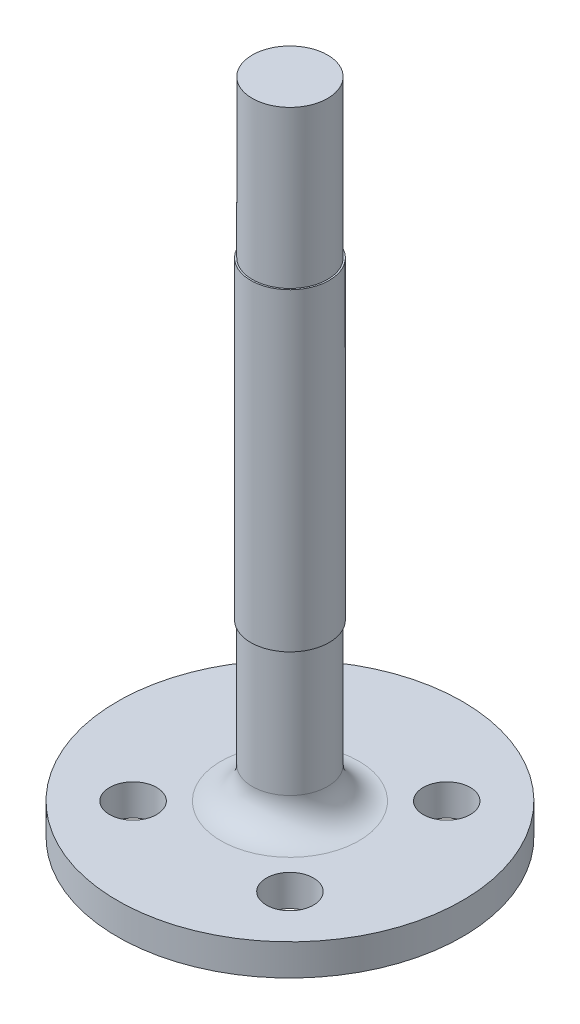
ISO-10303-21;
HEADER;
FILE_DESCRIPTION(('STEP AP214'),'2;1');
FILE_NAME('part.step','',(''),(''),'','','');
FILE_SCHEMA(('AUTOMOTIVE_DESIGN { 1 0 10303 214 1 1 1 1 }'));
ENDSEC;
DATA;
#1=APPLICATION_CONTEXT('core data for automotive mechanical design processes');
#2=APPLICATION_PROTOCOL_DEFINITION('international standard','automotive_design',2000,#1);
#3=PRODUCT_CONTEXT('',#1,'mechanical');
#4=PRODUCT('Part','Part','',(#3));
#5=PRODUCT_RELATED_PRODUCT_CATEGORY('part','',(#4));
#6=PRODUCT_DEFINITION_FORMATION('','',#4);
#7=PRODUCT_DEFINITION_CONTEXT('part definition',#1,'design');
#8=PRODUCT_DEFINITION('design','',#6,#7);
#9=PRODUCT_DEFINITION_SHAPE('','',#8);
#10=(LENGTH_UNIT() NAMED_UNIT(*) SI_UNIT(.MILLI.,.METRE.));
#11=(NAMED_UNIT(*) PLANE_ANGLE_UNIT() SI_UNIT($,.RADIAN.));
#12=(NAMED_UNIT(*) SI_UNIT($,.STERADIAN.) SOLID_ANGLE_UNIT());
#13=UNCERTAINTY_MEASURE_WITH_UNIT(LENGTH_MEASURE(1.E-05),#10,'distance_accuracy_value','');
#14=(GEOMETRIC_REPRESENTATION_CONTEXT(3) GLOBAL_UNCERTAINTY_ASSIGNED_CONTEXT((#13)) GLOBAL_UNIT_ASSIGNED_CONTEXT((#10,
#11,#12)) REPRESENTATION_CONTEXT('',''));
#15=CARTESIAN_POINT('',(0.,0.,0.));
#16=DIRECTION('',(0.,0.,1.));
#17=DIRECTION('',(1.,0.,0.));
#18=AXIS2_PLACEMENT_3D('',#15,#16,#17);
#19=CARTESIAN_POINT('',(0.,40.,0.));
#20=DIRECTION('',(0.,-1.,0.));
#21=DIRECTION('',(0.,0.,-1.));
#22=AXIS2_PLACEMENT_3D('',#19,#20,#21);
#23=CYLINDRICAL_SURFACE('',#22,2.4);
#24=CARTESIAN_POINT('',(0.,2.,0.));
#25=DIRECTION('',(0.,-1.,0.));
#26=DIRECTION('',(0.,0.,-1.));
#27=AXIS2_PLACEMENT_3D('',#24,#25,#26);
#28=CIRCLE('',#27,2.39999999999999);
#29=CARTESIAN_POINT('',(0.,2.00000000000001,-2.39999999999999));
#30=VERTEX_POINT('',#29);
#31=EDGE_CURVE('E65',#30,#30,#28,.T.);
#32=ORIENTED_EDGE('',*,*,#31,.F.);
#33=EDGE_LOOP('',(#32));
#34=FACE_BOUND('',#33,.T.);
#35=CARTESIAN_POINT('',(0.,10.,0.));
#36=DIRECTION('',(0.,-1.,0.));
#37=DIRECTION('',(0.,0.,-1.));
#38=AXIS2_PLACEMENT_3D('',#35,#36,#37);
#39=CIRCLE('',#38,2.4);
#40=CARTESIAN_POINT('',(0.,10.,-2.4));
#41=VERTEX_POINT('',#40);
#42=EDGE_CURVE('E48',#41,#41,#39,.T.);
#43=ORIENTED_EDGE('',*,*,#42,.T.);
#44=EDGE_LOOP('',(#43));
#45=FACE_BOUND('',#44,.T.);
#46=ADVANCED_FACE('F45',(#34,#45),#23,.T.);
#47=CARTESIAN_POINT('',(0.,10.,0.));
#48=DIRECTION('',(0.,1.,0.));
#49=DIRECTION('',(0.,0.,1.));
#50=AXIS2_PLACEMENT_3D('',#47,#48,#49);
#51=CYLINDRICAL_SURFACE('',#50,2.5);
#52=CARTESIAN_POINT('',(0.,10.,0.));
#53=DIRECTION('',(0.,-1.,0.));
#54=DIRECTION('',(0.,0.,-1.));
#55=AXIS2_PLACEMENT_3D('',#52,#53,#54);
#56=CIRCLE('',#55,2.5);
#57=CARTESIAN_POINT('',(0.,10.,-2.5));
#58=VERTEX_POINT('',#57);
#59=EDGE_CURVE('E64',#58,#58,#56,.T.);
#60=ORIENTED_EDGE('',*,*,#59,.F.);
#61=EDGE_LOOP('',(#60));
#62=FACE_BOUND('',#61,.T.);
#63=CARTESIAN_POINT('',(0.,30.,0.));
#64=DIRECTION('',(0.,-1.,0.));
#65=DIRECTION('',(0.,0.,-1.));
#66=AXIS2_PLACEMENT_3D('',#63,#64,#65);
#67=CIRCLE('',#66,2.5);
#68=CARTESIAN_POINT('',(0.,30.,-2.5));
#69=VERTEX_POINT('',#68);
#70=EDGE_CURVE('E60',#69,#69,#67,.T.);
#71=ORIENTED_EDGE('',*,*,#70,.T.);
#72=EDGE_LOOP('',(#71));
#73=FACE_BOUND('',#72,.T.);
#74=ADVANCED_FACE('F158',(#62,#73),#51,.T.);
#75=CARTESIAN_POINT('',(0.,10.,0.));
#76=DIRECTION('',(0.,-1.,0.));
#77=DIRECTION('',(0.,0.,-1.));
#78=AXIS2_PLACEMENT_3D('',#75,#76,#77);
#79=PLANE('',#78);
#80=ORIENTED_EDGE('',*,*,#42,.F.);
#81=EDGE_LOOP('',(#80));
#82=FACE_BOUND('',#81,.T.);
#83=ORIENTED_EDGE('',*,*,#59,.T.);
#84=EDGE_LOOP('',(#83));
#85=FACE_BOUND('',#84,.T.);
#86=ADVANCED_FACE('F166',(#82,#85),#79,.T.);
#87=CARTESIAN_POINT('',(0.,30.,0.));
#88=DIRECTION('',(0.,-1.,0.));
#89=DIRECTION('',(0.,0.,-1.));
#90=AXIS2_PLACEMENT_3D('',#87,#88,#89);
#91=PLANE('',#90);
#92=CARTESIAN_POINT('',(0.,30.,0.));
#93=DIRECTION('',(0.,-1.,0.));
#94=DIRECTION('',(0.,0.,-1.));
#95=AXIS2_PLACEMENT_3D('',#92,#93,#94);
#96=CIRCLE('',#95,2.4);
#97=CARTESIAN_POINT('',(0.,30.,-2.4));
#98=VERTEX_POINT('',#97);
#99=EDGE_CURVE('E10',#98,#98,#96,.T.);
#100=ORIENTED_EDGE('',*,*,#99,.T.);
#101=EDGE_LOOP('',(#100));
#102=FACE_BOUND('',#101,.T.);
#103=ORIENTED_EDGE('',*,*,#70,.F.);
#104=EDGE_LOOP('',(#103));
#105=FACE_BOUND('',#104,.T.);
#106=ADVANCED_FACE('F181',(#102,#105),#91,.F.);
#107=CARTESIAN_POINT('',(0.,40.,0.));
#108=DIRECTION('',(0.,1.,0.));
#109=DIRECTION('',(0.,0.,1.));
#110=AXIS2_PLACEMENT_3D('',#107,#108,#109);
#111=PLANE('',#110);
#112=CARTESIAN_POINT('',(0.,40.,0.));
#113=DIRECTION('',(0.,1.,0.));
#114=DIRECTION('',(0.,0.,1.));
#115=AXIS2_PLACEMENT_3D('',#112,#113,#114);
#116=CIRCLE('',#115,2.4);
#117=CARTESIAN_POINT('',(0.,40.,2.4));
#118=VERTEX_POINT('',#117);
#119=EDGE_CURVE('E53',#118,#118,#116,.T.);
#120=ORIENTED_EDGE('',*,*,#119,.T.);
#121=EDGE_LOOP('',(#120));
#122=FACE_BOUND('',#121,.T.);
#123=ADVANCED_FACE('F172',(#122),#111,.T.);
#124=ORIENTED_EDGE('',*,*,#119,.F.);
#125=EDGE_LOOP('',(#124));
#126=FACE_BOUND('',#125,.T.);
#127=ORIENTED_EDGE('',*,*,#99,.F.);
#128=EDGE_LOOP('',(#127));
#129=FACE_BOUND('',#128,.T.);
#130=ADVANCED_FACE('F160',(#126,#129),#23,.T.);
#131=CARTESIAN_POINT('',(0.,2.,0.));
#132=DIRECTION('',(0.,-1.,0.));
#133=DIRECTION('',(0.,0.,-1.));
#134=AXIS2_PLACEMENT_3D('',#131,#132,#133);
#135=TOROIDAL_SURFACE('',#134,4.39999999999999,2.);
#136=CARTESIAN_POINT('',(0.,0.,0.));
#137=DIRECTION('',(0.,-1.,0.));
#138=DIRECTION('',(0.,0.,-1.));
#139=AXIS2_PLACEMENT_3D('',#136,#137,#138);
#140=CIRCLE('',#139,4.4);
#141=CARTESIAN_POINT('',(0.,0.,-4.4));
#142=VERTEX_POINT('',#141);
#143=EDGE_CURVE('E72',#142,#142,#140,.T.);
#144=ORIENTED_EDGE('',*,*,#143,.F.);
#145=EDGE_LOOP('',(#144));
#146=FACE_BOUND('',#145,.T.);
#147=ORIENTED_EDGE('',*,*,#31,.T.);
#148=EDGE_LOOP('',(#147));
#149=FACE_BOUND('',#148,.T.);
#150=ADVANCED_FACE('F171',(#146,#149),#135,.F.);
#151=CARTESIAN_POINT('',(0.,-2.,0.));
#152=DIRECTION('',(0.,1.,0.));
#153=DIRECTION('',(0.,0.,1.));
#154=AXIS2_PLACEMENT_3D('',#151,#152,#153);
#155=CYLINDRICAL_SURFACE('',#154,11.);
#156=CARTESIAN_POINT('',(0.,-2.,0.));
#157=DIRECTION('',(0.,-1.,0.));
#158=DIRECTION('',(0.,0.,-1.));
#159=AXIS2_PLACEMENT_3D('',#156,#157,#158);
#160=CIRCLE('',#159,11.);
#161=CARTESIAN_POINT('',(0.,-2.,-11.));
#162=VERTEX_POINT('',#161);
#163=EDGE_CURVE('E105',#162,#162,#160,.T.);
#164=ORIENTED_EDGE('',*,*,#163,.F.);
#165=EDGE_LOOP('',(#164));
#166=FACE_BOUND('',#165,.T.);
#167=CARTESIAN_POINT('',(0.,0.,0.));
#168=DIRECTION('',(0.,-1.,0.));
#169=DIRECTION('',(0.,0.,-1.));
#170=AXIS2_PLACEMENT_3D('',#167,#168,#169);
#171=CIRCLE('',#170,11.);
#172=CARTESIAN_POINT('',(0.,0.,-11.));
#173=VERTEX_POINT('',#172);
#174=EDGE_CURVE('E82',#173,#173,#171,.T.);
#175=ORIENTED_EDGE('',*,*,#174,.T.);
#176=EDGE_LOOP('',(#175));
#177=FACE_BOUND('',#176,.T.);
#178=ADVANCED_FACE('F177',(#166,#177),#155,.T.);
#179=CARTESIAN_POINT('',(4.99999999999997,-2.,-5.00000000000003));
#180=DIRECTION('',(0.,1.,0.));
#181=DIRECTION('',(0.,0.,1.));
#182=AXIS2_PLACEMENT_3D('',#179,#180,#181);
#183=CYLINDRICAL_SURFACE('',#182,1.5);
#184=CARTESIAN_POINT('',(4.99999999999997,-2.,-5.00000000000003));
#185=DIRECTION('',(0.,-1.,0.));
#186=DIRECTION('',(0.,0.,-1.));
#187=AXIS2_PLACEMENT_3D('',#184,#185,#186);
#188=CIRCLE('',#187,1.5);
#189=CARTESIAN_POINT('',(4.99999999999997,-2.,-6.50000000000003));
#190=VERTEX_POINT('',#189);
#191=EDGE_CURVE('E109',#190,#190,#188,.T.);
#192=ORIENTED_EDGE('',*,*,#191,.T.);
#193=EDGE_LOOP('',(#192));
#194=FACE_BOUND('',#193,.T.);
#195=CARTESIAN_POINT('',(4.99999999999997,0.,-5.00000000000003));
#196=DIRECTION('',(0.,-1.,0.));
#197=DIRECTION('',(0.,0.,-1.));
#198=AXIS2_PLACEMENT_3D('',#195,#196,#197);
#199=CIRCLE('',#198,1.5);
#200=CARTESIAN_POINT('',(4.99999999999997,0.,-6.50000000000003));
#201=VERTEX_POINT('',#200);
#202=EDGE_CURVE('E86',#201,#201,#199,.T.);
#203=ORIENTED_EDGE('',*,*,#202,.F.);
#204=EDGE_LOOP('',(#203));
#205=FACE_BOUND('',#204,.T.);
#206=ADVANCED_FACE('F201',(#194,#205),#183,.F.);
#207=CARTESIAN_POINT('',(-5.00000000000005,-2.,-4.99999999999995));
#208=DIRECTION('',(0.,1.,0.));
#209=DIRECTION('',(0.,0.,1.));
#210=AXIS2_PLACEMENT_3D('',#207,#208,#209);
#211=CYLINDRICAL_SURFACE('',#210,1.5);
#212=CARTESIAN_POINT('',(-5.00000000000005,-2.,-4.99999999999995));
#213=DIRECTION('',(0.,-1.,0.));
#214=DIRECTION('',(0.,0.,-1.));
#215=AXIS2_PLACEMENT_3D('',#212,#213,#214);
#216=CIRCLE('',#215,1.5);
#217=CARTESIAN_POINT('',(-5.00000000000005,-2.,-6.49999999999995));
#218=VERTEX_POINT('',#217);
#219=EDGE_CURVE('E113',#218,#218,#216,.T.);
#220=ORIENTED_EDGE('',*,*,#219,.T.);
#221=EDGE_LOOP('',(#220));
#222=FACE_BOUND('',#221,.T.);
#223=CARTESIAN_POINT('',(-5.00000000000005,0.,-4.99999999999995));
#224=DIRECTION('',(0.,-1.,0.));
#225=DIRECTION('',(0.,0.,-1.));
#226=AXIS2_PLACEMENT_3D('',#223,#224,#225);
#227=CIRCLE('',#226,1.5);
#228=CARTESIAN_POINT('',(-5.00000000000005,0.,-6.49999999999995));
#229=VERTEX_POINT('',#228);
#230=EDGE_CURVE('E90',#229,#229,#227,.T.);
#231=ORIENTED_EDGE('',*,*,#230,.F.);
#232=EDGE_LOOP('',(#231));
#233=FACE_BOUND('',#232,.T.);
#234=ADVANCED_FACE('F197',(#222,#233),#211,.F.);
#235=CARTESIAN_POINT('',(5.00000000000002,-2.,4.99999999999998));
#236=DIRECTION('',(0.,1.,0.));
#237=DIRECTION('',(0.,0.,1.));
#238=AXIS2_PLACEMENT_3D('',#235,#236,#237);
#239=CYLINDRICAL_SURFACE('',#238,1.5);
#240=CARTESIAN_POINT('',(5.00000000000002,-2.,4.99999999999998));
#241=DIRECTION('',(0.,-1.,0.));
#242=DIRECTION('',(0.,0.,-1.));
#243=AXIS2_PLACEMENT_3D('',#240,#241,#242);
#244=CIRCLE('',#243,1.5);
#245=CARTESIAN_POINT('',(5.00000000000002,-2.,3.49999999999998));
#246=VERTEX_POINT('',#245);
#247=EDGE_CURVE('E117',#246,#246,#244,.T.);
#248=ORIENTED_EDGE('',*,*,#247,.T.);
#249=EDGE_LOOP('',(#248));
#250=FACE_BOUND('',#249,.T.);
#251=CARTESIAN_POINT('',(5.00000000000002,0.,4.99999999999998));
#252=DIRECTION('',(0.,-1.,0.));
#253=DIRECTION('',(0.,0.,-1.));
#254=AXIS2_PLACEMENT_3D('',#251,#252,#253);
#255=CIRCLE('',#254,1.5);
#256=CARTESIAN_POINT('',(5.00000000000002,0.,3.49999999999998));
#257=VERTEX_POINT('',#256);
#258=EDGE_CURVE('E94',#257,#257,#255,.T.);
#259=ORIENTED_EDGE('',*,*,#258,.F.);
#260=EDGE_LOOP('',(#259));
#261=FACE_BOUND('',#260,.T.);
#262=ADVANCED_FACE('F194',(#250,#261),#239,.F.);
#263=CARTESIAN_POINT('',(-5.,-2.,5.));
#264=DIRECTION('',(0.,1.,0.));
#265=DIRECTION('',(0.,0.,1.));
#266=AXIS2_PLACEMENT_3D('',#263,#264,#265);
#267=CYLINDRICAL_SURFACE('',#266,1.5);
#268=CARTESIAN_POINT('',(-5.,-2.,5.));
#269=DIRECTION('',(0.,-1.,0.));
#270=DIRECTION('',(0.,0.,-1.));
#271=AXIS2_PLACEMENT_3D('',#268,#269,#270);
#272=CIRCLE('',#271,1.5);
#273=CARTESIAN_POINT('',(-5.,-2.,3.5));
#274=VERTEX_POINT('',#273);
#275=EDGE_CURVE('E81',#274,#274,#272,.T.);
#276=ORIENTED_EDGE('',*,*,#275,.T.);
#277=EDGE_LOOP('',(#276));
#278=FACE_BOUND('',#277,.T.);
#279=CARTESIAN_POINT('',(-5.,0.,5.));
#280=DIRECTION('',(0.,-1.,0.));
#281=DIRECTION('',(0.,0.,-1.));
#282=AXIS2_PLACEMENT_3D('',#279,#280,#281);
#283=CIRCLE('',#282,1.5);
#284=CARTESIAN_POINT('',(-5.,0.,3.5));
#285=VERTEX_POINT('',#284);
#286=EDGE_CURVE('E98',#285,#285,#283,.T.);
#287=ORIENTED_EDGE('',*,*,#286,.F.);
#288=EDGE_LOOP('',(#287));
#289=FACE_BOUND('',#288,.T.);
#290=ADVANCED_FACE('F125',(#278,#289),#267,.F.);
#291=CARTESIAN_POINT('',(0.,-2.,0.));
#292=DIRECTION('',(0.,1.,0.));
#293=DIRECTION('',(0.,0.,1.));
#294=AXIS2_PLACEMENT_3D('',#291,#292,#293);
#295=CYLINDRICAL_SURFACE('',#294,2.4);
#296=CARTESIAN_POINT('',(0.,-2.,0.));
#297=DIRECTION('',(0.,-1.,0.));
#298=DIRECTION('',(0.,0.,-1.));
#299=AXIS2_PLACEMENT_3D('',#296,#297,#298);
#300=CIRCLE('',#299,2.4);
#301=CARTESIAN_POINT('',(0.,-2.,-2.4));
#302=VERTEX_POINT('',#301);
#303=EDGE_CURVE('E76',#302,#302,#300,.T.);
#304=ORIENTED_EDGE('',*,*,#303,.T.);
#305=EDGE_LOOP('',(#304));
#306=FACE_BOUND('',#305,.T.);
#307=CARTESIAN_POINT('',(0.,0.,0.));
#308=DIRECTION('',(0.,-1.,0.));
#309=DIRECTION('',(0.,0.,-1.));
#310=AXIS2_PLACEMENT_3D('',#307,#308,#309);
#311=CIRCLE('',#310,2.4);
#312=CARTESIAN_POINT('',(0.,0.,-2.4));
#313=VERTEX_POINT('',#312);
#314=EDGE_CURVE('E77',#313,#313,#311,.T.);
#315=ORIENTED_EDGE('',*,*,#314,.F.);
#316=EDGE_LOOP('',(#315));
#317=FACE_BOUND('',#316,.T.);
#318=ADVANCED_FACE('F132',(#306,#317),#295,.F.);
#319=CARTESIAN_POINT('',(0.,-2.,0.));
#320=DIRECTION('',(0.,-1.,0.));
#321=DIRECTION('',(0.,0.,-1.));
#322=AXIS2_PLACEMENT_3D('',#319,#320,#321);
#323=PLANE('',#322);
#324=ORIENTED_EDGE('',*,*,#275,.F.);
#325=EDGE_LOOP('',(#324));
#326=FACE_BOUND('',#325,.T.);
#327=ORIENTED_EDGE('',*,*,#247,.F.);
#328=EDGE_LOOP('',(#327));
#329=FACE_BOUND('',#328,.T.);
#330=ORIENTED_EDGE('',*,*,#219,.F.);
#331=EDGE_LOOP('',(#330));
#332=FACE_BOUND('',#331,.T.);
#333=ORIENTED_EDGE('',*,*,#191,.F.);
#334=EDGE_LOOP('',(#333));
#335=FACE_BOUND('',#334,.T.);
#336=ORIENTED_EDGE('',*,*,#163,.T.);
#337=EDGE_LOOP('',(#336));
#338=FACE_BOUND('',#337,.T.);
#339=ORIENTED_EDGE('',*,*,#303,.F.);
#340=EDGE_LOOP('',(#339));
#341=FACE_BOUND('',#340,.T.);
#342=ADVANCED_FACE('F128',(#326,#329,#332,#335,#338,#341),#323,.T.);
#343=CARTESIAN_POINT('',(0.,0.,0.));
#344=DIRECTION('',(0.,-1.,0.));
#345=DIRECTION('',(0.,0.,-1.));
#346=AXIS2_PLACEMENT_3D('',#343,#344,#345);
#347=PLANE('',#346);
#348=ORIENTED_EDGE('',*,*,#143,.T.);
#349=EDGE_LOOP('',(#348));
#350=FACE_BOUND('',#349,.T.);
#351=ORIENTED_EDGE('',*,*,#286,.T.);
#352=EDGE_LOOP('',(#351));
#353=FACE_BOUND('',#352,.T.);
#354=ORIENTED_EDGE('',*,*,#258,.T.);
#355=EDGE_LOOP('',(#354));
#356=FACE_BOUND('',#355,.T.);
#357=ORIENTED_EDGE('',*,*,#230,.T.);
#358=EDGE_LOOP('',(#357));
#359=FACE_BOUND('',#358,.T.);
#360=ORIENTED_EDGE('',*,*,#202,.T.);
#361=EDGE_LOOP('',(#360));
#362=FACE_BOUND('',#361,.T.);
#363=ORIENTED_EDGE('',*,*,#174,.F.);
#364=EDGE_LOOP('',(#363));
#365=FACE_BOUND('',#364,.T.);
#366=ADVANCED_FACE('F131',(#350,#353,#356,#359,#362,#365),#347,.F.);
#367=CARTESIAN_POINT('',(0.,0.,0.));
#368=DIRECTION('',(0.,1.,0.));
#369=DIRECTION('',(0.,0.,1.));
#370=AXIS2_PLACEMENT_3D('',#367,#368,#369);
#371=PLANE('',#370);
#372=ORIENTED_EDGE('',*,*,#314,.T.);
#373=EDGE_LOOP('',(#372));
#374=FACE_BOUND('',#373,.T.);
#375=ADVANCED_FACE('F149',(#374),#371,.F.);
#376=CLOSED_SHELL('',(#46,#74,#86,#106,#123,#130,#150,#178,#206,#234,#262,#290,#318,#342,#366,#375));
#377=MANIFOLD_SOLID_BREP('B2',#376);
#378=ADVANCED_BREP_SHAPE_REPRESENTATION('',(#18,#377),#14);
#379=SHAPE_DEFINITION_REPRESENTATION(#9,#378);
ENDSEC;
END-ISO-10303-21;
